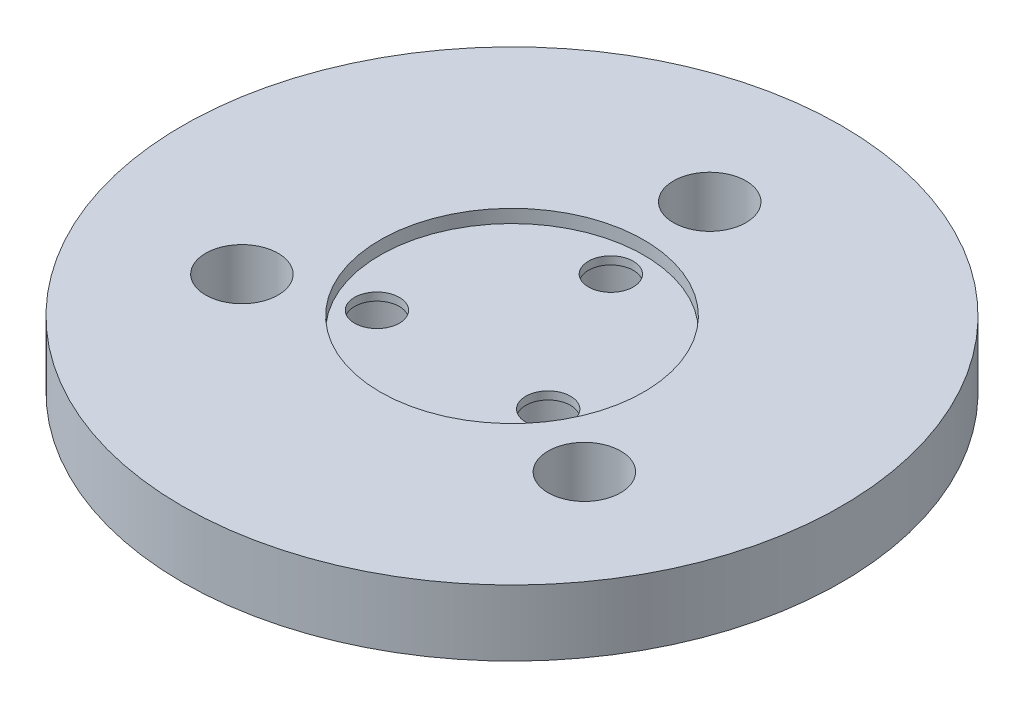
ISO-10303-21;
HEADER;
FILE_DESCRIPTION(('STEP AP214'),'2;1');
FILE_NAME('part.step','',(''),(''),'','','');
FILE_SCHEMA(('AUTOMOTIVE_DESIGN { 1 0 10303 214 1 1 1 1 }'));
ENDSEC;
DATA;
#1=APPLICATION_CONTEXT('core data for automotive mechanical design processes');
#2=APPLICATION_PROTOCOL_DEFINITION('international standard','automotive_design',2000,#1);
#3=PRODUCT_CONTEXT('',#1,'mechanical');
#4=PRODUCT('Part','Part','',(#3));
#5=PRODUCT_RELATED_PRODUCT_CATEGORY('part','',(#4));
#6=PRODUCT_DEFINITION_FORMATION('','',#4);
#7=PRODUCT_DEFINITION_CONTEXT('part definition',#1,'design');
#8=PRODUCT_DEFINITION('design','',#6,#7);
#9=PRODUCT_DEFINITION_SHAPE('','',#8);
#10=(LENGTH_UNIT() NAMED_UNIT(*) SI_UNIT(.MILLI.,.METRE.));
#11=(NAMED_UNIT(*) PLANE_ANGLE_UNIT() SI_UNIT($,.RADIAN.));
#12=(NAMED_UNIT(*) SI_UNIT($,.STERADIAN.) SOLID_ANGLE_UNIT());
#13=UNCERTAINTY_MEASURE_WITH_UNIT(LENGTH_MEASURE(1.E-05),#10,'distance_accuracy_value','');
#14=(GEOMETRIC_REPRESENTATION_CONTEXT(3) GLOBAL_UNCERTAINTY_ASSIGNED_CONTEXT((#13)) GLOBAL_UNIT_ASSIGNED_CONTEXT((#10,
#11,#12)) REPRESENTATION_CONTEXT('',''));
#15=CARTESIAN_POINT('',(0.,0.,0.));
#16=DIRECTION('',(0.,0.,1.));
#17=DIRECTION('',(1.,0.,0.));
#18=AXIS2_PLACEMENT_3D('',#15,#16,#17);
#19=CARTESIAN_POINT('',(0.,5.,0.));
#20=DIRECTION('',(0.,-1.,0.));
#21=DIRECTION('',(0.,0.,-1.));
#22=AXIS2_PLACEMENT_3D('',#19,#20,#21);
#23=CYLINDRICAL_SURFACE('',#22,25.);
#24=CARTESIAN_POINT('',(0.,5.,0.));
#25=DIRECTION('',(0.,1.,0.));
#26=DIRECTION('',(0.,0.,1.));
#27=AXIS2_PLACEMENT_3D('',#24,#25,#26);
#28=CIRCLE('',#27,25.);
#29=CARTESIAN_POINT('',(0.,5.,25.));
#30=VERTEX_POINT('',#29);
#31=EDGE_CURVE('E9',#30,#30,#28,.T.);
#32=ORIENTED_EDGE('',*,*,#31,.F.);
#33=EDGE_LOOP('',(#32));
#34=FACE_BOUND('',#33,.T.);
#35=CARTESIAN_POINT('',(0.,0.,0.));
#36=DIRECTION('',(0.,1.,0.));
#37=DIRECTION('',(0.,0.,1.));
#38=AXIS2_PLACEMENT_3D('',#35,#36,#37);
#39=CIRCLE('',#38,25.);
#40=CARTESIAN_POINT('',(0.,0.,25.));
#41=VERTEX_POINT('',#40);
#42=EDGE_CURVE('E21',#41,#41,#39,.T.);
#43=ORIENTED_EDGE('',*,*,#42,.T.);
#44=EDGE_LOOP('',(#43));
#45=FACE_BOUND('',#44,.T.);
#46=ADVANCED_FACE('F14',(#34,#45),#23,.T.);
#47=CARTESIAN_POINT('',(0.,5.,0.));
#48=DIRECTION('',(0.,1.,0.));
#49=DIRECTION('',(0.,0.,1.));
#50=AXIS2_PLACEMENT_3D('',#47,#48,#49);
#51=PLANE('',#50);
#52=CARTESIAN_POINT('',(12.9903810567666,5.,7.49999999999988));
#53=DIRECTION('',(0.,1.,0.));
#54=DIRECTION('',(0.,0.,1.));
#55=AXIS2_PLACEMENT_3D('',#52,#53,#54);
#56=CIRCLE('',#55,2.75);
#57=CARTESIAN_POINT('',(12.9903810567666,5.,10.2499999999999));
#58=VERTEX_POINT('',#57);
#59=EDGE_CURVE('E142',#58,#58,#56,.T.);
#60=ORIENTED_EDGE('',*,*,#59,.F.);
#61=EDGE_LOOP('',(#60));
#62=FACE_BOUND('',#61,.T.);
#63=CARTESIAN_POINT('',(-12.9903810567665,5.,7.5));
#64=DIRECTION('',(0.,1.,0.));
#65=DIRECTION('',(0.,0.,1.));
#66=AXIS2_PLACEMENT_3D('',#63,#64,#65);
#67=CIRCLE('',#66,2.75);
#68=CARTESIAN_POINT('',(-12.9903810567665,5.,10.25));
#69=VERTEX_POINT('',#68);
#70=EDGE_CURVE('E144',#69,#69,#67,.T.);
#71=ORIENTED_EDGE('',*,*,#70,.F.);
#72=EDGE_LOOP('',(#71));
#73=FACE_BOUND('',#72,.T.);
#74=CARTESIAN_POINT('',(0.,5.,-15.));
#75=DIRECTION('',(0.,1.,0.));
#76=DIRECTION('',(0.,0.,1.));
#77=AXIS2_PLACEMENT_3D('',#74,#75,#76);
#78=CIRCLE('',#77,2.75);
#79=CARTESIAN_POINT('',(0.,5.,-12.25));
#80=VERTEX_POINT('',#79);
#81=EDGE_CURVE('E152',#80,#80,#78,.T.);
#82=ORIENTED_EDGE('',*,*,#81,.F.);
#83=EDGE_LOOP('',(#82));
#84=FACE_BOUND('',#83,.T.);
#85=CARTESIAN_POINT('',(0.,5.,0.));
#86=DIRECTION('',(0.,1.,0.));
#87=DIRECTION('',(0.,0.,1.));
#88=AXIS2_PLACEMENT_3D('',#85,#86,#87);
#89=CIRCLE('',#88,10.);
#90=CARTESIAN_POINT('',(0.,5.,10.));
#91=VERTEX_POINT('',#90);
#92=EDGE_CURVE('E29',#91,#91,#89,.T.);
#93=ORIENTED_EDGE('',*,*,#92,.F.);
#94=EDGE_LOOP('',(#93));
#95=FACE_BOUND('',#94,.T.);
#96=ORIENTED_EDGE('',*,*,#31,.T.);
#97=EDGE_LOOP('',(#96));
#98=FACE_BOUND('',#97,.T.);
#99=ADVANCED_FACE('F65',(#62,#73,#84,#95,#98),#51,.T.);
#100=CARTESIAN_POINT('',(0.,0.,0.));
#101=DIRECTION('',(0.,1.,0.));
#102=DIRECTION('',(0.,0.,1.));
#103=AXIS2_PLACEMENT_3D('',#100,#101,#102);
#104=PLANE('',#103);
#105=CARTESIAN_POINT('',(12.9903810567666,0.,7.49999999999988));
#106=DIRECTION('',(0.,1.,0.));
#107=DIRECTION('',(0.,0.,1.));
#108=AXIS2_PLACEMENT_3D('',#105,#106,#107);
#109=CIRCLE('',#108,2.75);
#110=CARTESIAN_POINT('',(12.9903810567666,0.,10.2499999999999));
#111=VERTEX_POINT('',#110);
#112=EDGE_CURVE('E140',#111,#111,#109,.T.);
#113=ORIENTED_EDGE('',*,*,#112,.T.);
#114=EDGE_LOOP('',(#113));
#115=FACE_BOUND('',#114,.T.);
#116=CARTESIAN_POINT('',(-12.9903810567665,0.,7.5));
#117=DIRECTION('',(0.,1.,0.));
#118=DIRECTION('',(0.,0.,1.));
#119=AXIS2_PLACEMENT_3D('',#116,#117,#118);
#120=CIRCLE('',#119,2.75);
#121=CARTESIAN_POINT('',(-12.9903810567665,0.,10.25));
#122=VERTEX_POINT('',#121);
#123=EDGE_CURVE('E149',#122,#122,#120,.T.);
#124=ORIENTED_EDGE('',*,*,#123,.T.);
#125=EDGE_LOOP('',(#124));
#126=FACE_BOUND('',#125,.T.);
#127=CARTESIAN_POINT('',(0.,0.,-15.));
#128=DIRECTION('',(0.,1.,0.));
#129=DIRECTION('',(0.,0.,1.));
#130=AXIS2_PLACEMENT_3D('',#127,#128,#129);
#131=CIRCLE('',#130,2.75);
#132=CARTESIAN_POINT('',(0.,0.,-12.25));
#133=VERTEX_POINT('',#132);
#134=EDGE_CURVE('E155',#133,#133,#131,.T.);
#135=ORIENTED_EDGE('',*,*,#134,.T.);
#136=EDGE_LOOP('',(#135));
#137=FACE_BOUND('',#136,.T.);
#138=CARTESIAN_POINT('',(-6.49519052838333,0.,3.74999999999994));
#139=DIRECTION('',(0.,-1.,0.));
#140=DIRECTION('',(0.,0.,-1.));
#141=AXIS2_PLACEMENT_3D('',#138,#139,#140);
#142=CIRCLE('',#141,3.25);
#143=CARTESIAN_POINT('',(-6.49519052838333,0.,0.49999999999994));
#144=VERTEX_POINT('',#143);
#145=EDGE_CURVE('E158',#144,#144,#142,.T.);
#146=ORIENTED_EDGE('',*,*,#145,.F.);
#147=EDGE_LOOP('',(#146));
#148=FACE_BOUND('',#147,.T.);
#149=CARTESIAN_POINT('',(6.49519052838327,0.,3.75));
#150=DIRECTION('',(0.,-1.,0.));
#151=DIRECTION('',(0.,0.,-1.));
#152=AXIS2_PLACEMENT_3D('',#149,#150,#151);
#153=CIRCLE('',#152,3.25);
#154=CARTESIAN_POINT('',(6.49519052838327,0.,0.5));
#155=VERTEX_POINT('',#154);
#156=EDGE_CURVE('E50',#155,#155,#153,.T.);
#157=ORIENTED_EDGE('',*,*,#156,.F.);
#158=EDGE_LOOP('',(#157));
#159=FACE_BOUND('',#158,.T.);
#160=CARTESIAN_POINT('',(0.,0.,-7.5));
#161=DIRECTION('',(0.,-1.,0.));
#162=DIRECTION('',(0.,0.,-1.));
#163=AXIS2_PLACEMENT_3D('',#160,#161,#162);
#164=CIRCLE('',#163,3.25);
#165=CARTESIAN_POINT('',(0.,0.,-10.75));
#166=VERTEX_POINT('',#165);
#167=EDGE_CURVE('E37',#166,#166,#164,.T.);
#168=ORIENTED_EDGE('',*,*,#167,.F.);
#169=EDGE_LOOP('',(#168));
#170=FACE_BOUND('',#169,.T.);
#171=ORIENTED_EDGE('',*,*,#42,.F.);
#172=EDGE_LOOP('',(#171));
#173=FACE_BOUND('',#172,.T.);
#174=ADVANCED_FACE('F67',(#115,#126,#137,#148,#159,#170,#173),#104,.F.);
#175=CARTESIAN_POINT('',(0.,4.,0.));
#176=DIRECTION('',(0.,1.,0.));
#177=DIRECTION('',(0.,0.,1.));
#178=AXIS2_PLACEMENT_3D('',#175,#176,#177);
#179=CYLINDRICAL_SURFACE('',#178,10.);
#180=CARTESIAN_POINT('',(0.,4.,0.));
#181=DIRECTION('',(0.,1.,0.));
#182=DIRECTION('',(0.,0.,1.));
#183=AXIS2_PLACEMENT_3D('',#180,#181,#182);
#184=CIRCLE('',#183,10.);
#185=CARTESIAN_POINT('',(0.,4.,10.));
#186=VERTEX_POINT('',#185);
#187=EDGE_CURVE('E26',#186,#186,#184,.T.);
#188=ORIENTED_EDGE('',*,*,#187,.F.);
#189=EDGE_LOOP('',(#188));
#190=FACE_BOUND('',#189,.T.);
#191=ORIENTED_EDGE('',*,*,#92,.T.);
#192=EDGE_LOOP('',(#191));
#193=FACE_BOUND('',#192,.T.);
#194=ADVANCED_FACE('F63',(#190,#193),#179,.F.);
#195=CARTESIAN_POINT('',(0.,4.,0.));
#196=DIRECTION('',(0.,1.,0.));
#197=DIRECTION('',(0.,0.,1.));
#198=AXIS2_PLACEMENT_3D('',#195,#196,#197);
#199=PLANE('',#198);
#200=CARTESIAN_POINT('',(-6.49519052838333,4.,3.74999999999994));
#201=DIRECTION('',(0.,1.,0.));
#202=DIRECTION('',(0.,0.,1.));
#203=AXIS2_PLACEMENT_3D('',#200,#201,#202);
#204=CIRCLE('',#203,1.7);
#205=CARTESIAN_POINT('',(-6.49519052838333,4.,5.44999999999994));
#206=VERTEX_POINT('',#205);
#207=EDGE_CURVE('E17',#206,#206,#204,.T.);
#208=ORIENTED_EDGE('',*,*,#207,.F.);
#209=EDGE_LOOP('',(#208));
#210=FACE_BOUND('',#209,.T.);
#211=CARTESIAN_POINT('',(6.49519052838327,4.,3.75));
#212=DIRECTION('',(0.,1.,0.));
#213=DIRECTION('',(0.,0.,1.));
#214=AXIS2_PLACEMENT_3D('',#211,#212,#213);
#215=CIRCLE('',#214,1.7);
#216=CARTESIAN_POINT('',(6.49519052838327,4.,5.45));
#217=VERTEX_POINT('',#216);
#218=EDGE_CURVE('E35',#217,#217,#215,.T.);
#219=ORIENTED_EDGE('',*,*,#218,.F.);
#220=EDGE_LOOP('',(#219));
#221=FACE_BOUND('',#220,.T.);
#222=CARTESIAN_POINT('',(0.,4.,-7.5));
#223=DIRECTION('',(0.,1.,0.));
#224=DIRECTION('',(0.,0.,1.));
#225=AXIS2_PLACEMENT_3D('',#222,#223,#224);
#226=CIRCLE('',#225,1.7);
#227=CARTESIAN_POINT('',(0.,4.,-5.8));
#228=VERTEX_POINT('',#227);
#229=EDGE_CURVE('E32',#228,#228,#226,.T.);
#230=ORIENTED_EDGE('',*,*,#229,.F.);
#231=EDGE_LOOP('',(#230));
#232=FACE_BOUND('',#231,.T.);
#233=ORIENTED_EDGE('',*,*,#187,.T.);
#234=EDGE_LOOP('',(#233));
#235=FACE_BOUND('',#234,.T.);
#236=ADVANCED_FACE('F83',(#210,#221,#232,#235),#199,.T.);
#237=CARTESIAN_POINT('',(0.,0.,-7.5));
#238=DIRECTION('',(0.,-1.,0.));
#239=DIRECTION('',(0.,0.,-1.));
#240=AXIS2_PLACEMENT_3D('',#237,#238,#239);
#241=CYLINDRICAL_SURFACE('',#240,1.7);
#242=ORIENTED_EDGE('',*,*,#229,.T.);
#243=EDGE_LOOP('',(#242));
#244=FACE_BOUND('',#243,.T.);
#245=CARTESIAN_POINT('',(0.,3.4,-7.5));
#246=DIRECTION('',(0.,-1.,0.));
#247=DIRECTION('',(0.,0.,-1.));
#248=AXIS2_PLACEMENT_3D('',#245,#246,#247);
#249=CIRCLE('',#248,1.7);
#250=CARTESIAN_POINT('',(0.,3.4,-9.2));
#251=VERTEX_POINT('',#250);
#252=EDGE_CURVE('E34',#251,#251,#249,.T.);
#253=ORIENTED_EDGE('',*,*,#252,.T.);
#254=EDGE_LOOP('',(#253));
#255=FACE_BOUND('',#254,.T.);
#256=ADVANCED_FACE('F87',(#244,#255),#241,.F.);
#257=CARTESIAN_POINT('',(1.7,3.4,-7.5));
#258=DIRECTION('',(0.,1.,0.));
#259=DIRECTION('',(0.,0.,1.));
#260=AXIS2_PLACEMENT_3D('',#257,#258,#259);
#261=PLANE('',#260);
#262=ORIENTED_EDGE('',*,*,#252,.F.);
#263=EDGE_LOOP('',(#262));
#264=FACE_BOUND('',#263,.T.);
#265=CARTESIAN_POINT('',(0.,3.4,-7.5));
#266=DIRECTION('',(0.,-1.,0.));
#267=DIRECTION('',(0.,0.,-1.));
#268=AXIS2_PLACEMENT_3D('',#265,#266,#267);
#269=CIRCLE('',#268,3.25);
#270=CARTESIAN_POINT('',(0.,3.4,-10.75));
#271=VERTEX_POINT('',#270);
#272=EDGE_CURVE('E42',#271,#271,#269,.T.);
#273=ORIENTED_EDGE('',*,*,#272,.T.);
#274=EDGE_LOOP('',(#273));
#275=FACE_BOUND('',#274,.T.);
#276=ADVANCED_FACE('F91',(#264,#275),#261,.F.);
#277=CARTESIAN_POINT('',(0.,0.,-7.5));
#278=DIRECTION('',(0.,-1.,0.));
#279=DIRECTION('',(0.,0.,-1.));
#280=AXIS2_PLACEMENT_3D('',#277,#278,#279);
#281=CYLINDRICAL_SURFACE('',#280,3.25);
#282=ORIENTED_EDGE('',*,*,#272,.F.);
#283=EDGE_LOOP('',(#282));
#284=FACE_BOUND('',#283,.T.);
#285=ORIENTED_EDGE('',*,*,#167,.T.);
#286=EDGE_LOOP('',(#285));
#287=FACE_BOUND('',#286,.T.);
#288=ADVANCED_FACE('F95',(#284,#287),#281,.F.);
#289=CARTESIAN_POINT('',(6.49519052838327,0.,3.75));
#290=DIRECTION('',(0.,-1.,0.));
#291=DIRECTION('',(0.,0.,-1.));
#292=AXIS2_PLACEMENT_3D('',#289,#290,#291);
#293=CYLINDRICAL_SURFACE('',#292,1.7);
#294=ORIENTED_EDGE('',*,*,#218,.T.);
#295=EDGE_LOOP('',(#294));
#296=FACE_BOUND('',#295,.T.);
#297=CARTESIAN_POINT('',(6.49519052838327,3.4,3.75));
#298=DIRECTION('',(0.,-1.,0.));
#299=DIRECTION('',(0.,0.,-1.));
#300=AXIS2_PLACEMENT_3D('',#297,#298,#299);
#301=CIRCLE('',#300,1.7);
#302=CARTESIAN_POINT('',(6.49519052838327,3.4,2.05));
#303=VERTEX_POINT('',#302);
#304=EDGE_CURVE('E38',#303,#303,#301,.T.);
#305=ORIENTED_EDGE('',*,*,#304,.T.);
#306=EDGE_LOOP('',(#305));
#307=FACE_BOUND('',#306,.T.);
#308=ADVANCED_FACE('F99',(#296,#307),#293,.F.);
#309=CARTESIAN_POINT('',(8.19519052838327,3.4,3.75));
#310=DIRECTION('',(0.,1.,0.));
#311=DIRECTION('',(0.,0.,1.));
#312=AXIS2_PLACEMENT_3D('',#309,#310,#311);
#313=PLANE('',#312);
#314=ORIENTED_EDGE('',*,*,#304,.F.);
#315=EDGE_LOOP('',(#314));
#316=FACE_BOUND('',#315,.T.);
#317=CARTESIAN_POINT('',(6.49519052838327,3.4,3.75));
#318=DIRECTION('',(0.,-1.,0.));
#319=DIRECTION('',(0.,0.,-1.));
#320=AXIS2_PLACEMENT_3D('',#317,#318,#319);
#321=CIRCLE('',#320,3.25);
#322=CARTESIAN_POINT('',(6.49519052838327,3.4,0.5));
#323=VERTEX_POINT('',#322);
#324=EDGE_CURVE('E45',#323,#323,#321,.T.);
#325=ORIENTED_EDGE('',*,*,#324,.T.);
#326=EDGE_LOOP('',(#325));
#327=FACE_BOUND('',#326,.T.);
#328=ADVANCED_FACE('F103',(#316,#327),#313,.F.);
#329=CARTESIAN_POINT('',(6.49519052838327,0.,3.75));
#330=DIRECTION('',(0.,-1.,0.));
#331=DIRECTION('',(0.,0.,-1.));
#332=AXIS2_PLACEMENT_3D('',#329,#330,#331);
#333=CYLINDRICAL_SURFACE('',#332,3.25);
#334=ORIENTED_EDGE('',*,*,#324,.F.);
#335=EDGE_LOOP('',(#334));
#336=FACE_BOUND('',#335,.T.);
#337=ORIENTED_EDGE('',*,*,#156,.T.);
#338=EDGE_LOOP('',(#337));
#339=FACE_BOUND('',#338,.T.);
#340=ADVANCED_FACE('F106',(#336,#339),#333,.F.);
#341=CARTESIAN_POINT('',(-6.49519052838333,0.,3.74999999999994));
#342=DIRECTION('',(0.,-1.,0.));
#343=DIRECTION('',(0.,0.,-1.));
#344=AXIS2_PLACEMENT_3D('',#341,#342,#343);
#345=CYLINDRICAL_SURFACE('',#344,1.7);
#346=ORIENTED_EDGE('',*,*,#207,.T.);
#347=EDGE_LOOP('',(#346));
#348=FACE_BOUND('',#347,.T.);
#349=CARTESIAN_POINT('',(-6.49519052838333,3.4,3.74999999999994));
#350=DIRECTION('',(0.,-1.,0.));
#351=DIRECTION('',(0.,0.,-1.));
#352=AXIS2_PLACEMENT_3D('',#349,#350,#351);
#353=CIRCLE('',#352,1.7);
#354=CARTESIAN_POINT('',(-6.49519052838333,3.4,2.04999999999994));
#355=VERTEX_POINT('',#354);
#356=EDGE_CURVE('E164',#355,#355,#353,.T.);
#357=ORIENTED_EDGE('',*,*,#356,.T.);
#358=EDGE_LOOP('',(#357));
#359=FACE_BOUND('',#358,.T.);
#360=ADVANCED_FACE('F110',(#348,#359),#345,.F.);
#361=CARTESIAN_POINT('',(-4.79519052838333,3.4,3.74999999999994));
#362=DIRECTION('',(0.,1.,0.));
#363=DIRECTION('',(0.,0.,1.));
#364=AXIS2_PLACEMENT_3D('',#361,#362,#363);
#365=PLANE('',#364);
#366=ORIENTED_EDGE('',*,*,#356,.F.);
#367=EDGE_LOOP('',(#366));
#368=FACE_BOUND('',#367,.T.);
#369=CARTESIAN_POINT('',(-6.49519052838333,3.4,3.74999999999994));
#370=DIRECTION('',(0.,-1.,0.));
#371=DIRECTION('',(0.,0.,-1.));
#372=AXIS2_PLACEMENT_3D('',#369,#370,#371);
#373=CIRCLE('',#372,3.25);
#374=CARTESIAN_POINT('',(-6.49519052838333,3.4,0.49999999999994));
#375=VERTEX_POINT('',#374);
#376=EDGE_CURVE('E161',#375,#375,#373,.T.);
#377=ORIENTED_EDGE('',*,*,#376,.T.);
#378=EDGE_LOOP('',(#377));
#379=FACE_BOUND('',#378,.T.);
#380=ADVANCED_FACE('F114',(#368,#379),#365,.F.);
#381=CARTESIAN_POINT('',(-6.49519052838333,0.,3.74999999999994));
#382=DIRECTION('',(0.,-1.,0.));
#383=DIRECTION('',(0.,0.,-1.));
#384=AXIS2_PLACEMENT_3D('',#381,#382,#383);
#385=CYLINDRICAL_SURFACE('',#384,3.25);
#386=ORIENTED_EDGE('',*,*,#376,.F.);
#387=EDGE_LOOP('',(#386));
#388=FACE_BOUND('',#387,.T.);
#389=ORIENTED_EDGE('',*,*,#145,.T.);
#390=EDGE_LOOP('',(#389));
#391=FACE_BOUND('',#390,.T.);
#392=ADVANCED_FACE('F118',(#388,#391),#385,.F.);
#393=CARTESIAN_POINT('',(0.,5.,-15.));
#394=DIRECTION('',(0.,1.,0.));
#395=DIRECTION('',(0.,0.,1.));
#396=AXIS2_PLACEMENT_3D('',#393,#394,#395);
#397=CYLINDRICAL_SURFACE('',#396,2.75);
#398=ORIENTED_EDGE('',*,*,#134,.F.);
#399=EDGE_LOOP('',(#398));
#400=FACE_BOUND('',#399,.T.);
#401=ORIENTED_EDGE('',*,*,#81,.T.);
#402=EDGE_LOOP('',(#401));
#403=FACE_BOUND('',#402,.T.);
#404=ADVANCED_FACE('F122',(#400,#403),#397,.F.);
#405=CARTESIAN_POINT('',(-12.9903810567665,5.,7.5));
#406=DIRECTION('',(0.,1.,0.));
#407=DIRECTION('',(0.,0.,1.));
#408=AXIS2_PLACEMENT_3D('',#405,#406,#407);
#409=CYLINDRICAL_SURFACE('',#408,2.75);
#410=ORIENTED_EDGE('',*,*,#123,.F.);
#411=EDGE_LOOP('',(#410));
#412=FACE_BOUND('',#411,.T.);
#413=ORIENTED_EDGE('',*,*,#70,.T.);
#414=EDGE_LOOP('',(#413));
#415=FACE_BOUND('',#414,.T.);
#416=ADVANCED_FACE('F126',(#412,#415),#409,.F.);
#417=CARTESIAN_POINT('',(12.9903810567666,5.,7.49999999999988));
#418=DIRECTION('',(0.,1.,0.));
#419=DIRECTION('',(0.,0.,1.));
#420=AXIS2_PLACEMENT_3D('',#417,#418,#419);
#421=CYLINDRICAL_SURFACE('',#420,2.75);
#422=ORIENTED_EDGE('',*,*,#112,.F.);
#423=EDGE_LOOP('',(#422));
#424=FACE_BOUND('',#423,.T.);
#425=ORIENTED_EDGE('',*,*,#59,.T.);
#426=EDGE_LOOP('',(#425));
#427=FACE_BOUND('',#426,.T.);
#428=ADVANCED_FACE('F130',(#424,#427),#421,.F.);
#429=CLOSED_SHELL('',(#46,#99,#174,#194,#236,#256,#276,#288,#308,#328,#340,#360,#380,#392,#404,
#416,#428));
#430=MANIFOLD_SOLID_BREP('B1',#429);
#431=ADVANCED_BREP_SHAPE_REPRESENTATION('',(#18,#430),#14);
#432=SHAPE_DEFINITION_REPRESENTATION(#9,#431);
ENDSEC;
END-ISO-10303-21;
